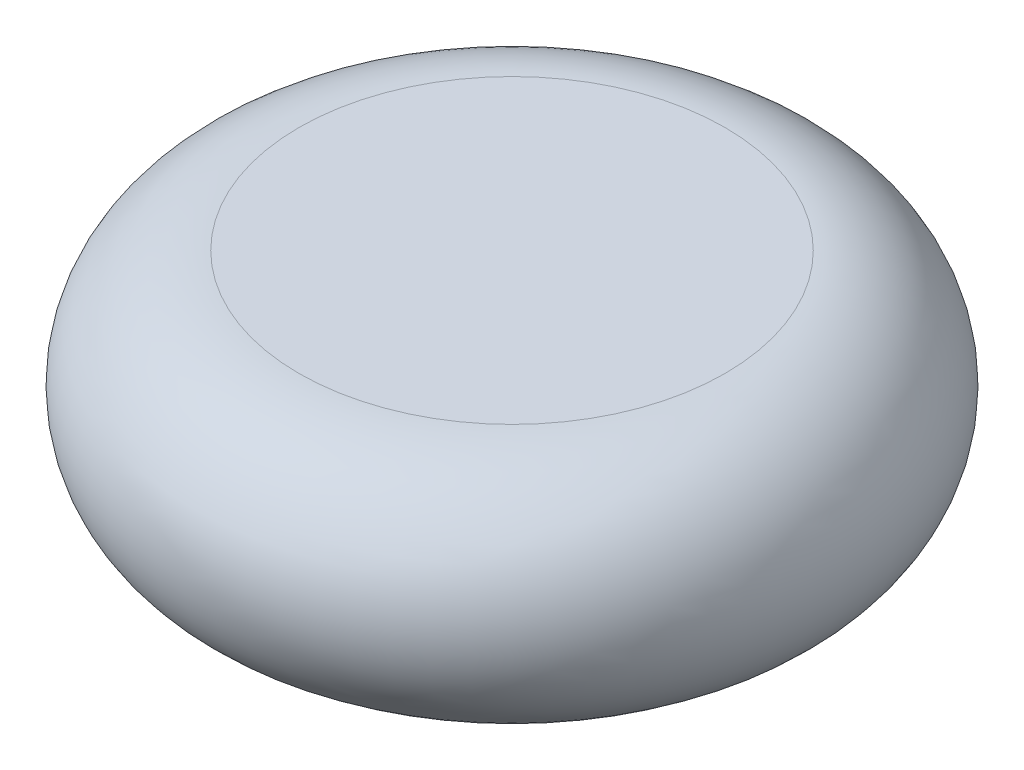
ISO-10303-21;
HEADER;
FILE_DESCRIPTION(('STEP AP214'),'2;1');
FILE_NAME('part.step','',(''),(''),'','','');
FILE_SCHEMA(('AUTOMOTIVE_DESIGN { 1 0 10303 214 1 1 1 1 }'));
ENDSEC;
DATA;
#1=APPLICATION_CONTEXT('core data for automotive mechanical design processes');
#2=APPLICATION_PROTOCOL_DEFINITION('international standard','automotive_design',2000,#1);
#3=PRODUCT_CONTEXT('',#1,'mechanical');
#4=PRODUCT('Part','Part','',(#3));
#5=PRODUCT_RELATED_PRODUCT_CATEGORY('part','',(#4));
#6=PRODUCT_DEFINITION_FORMATION('','',#4);
#7=PRODUCT_DEFINITION_CONTEXT('part definition',#1,'design');
#8=PRODUCT_DEFINITION('design','',#6,#7);
#9=PRODUCT_DEFINITION_SHAPE('','',#8);
#10=(LENGTH_UNIT() NAMED_UNIT(*) SI_UNIT(.MILLI.,.METRE.));
#11=(NAMED_UNIT(*) PLANE_ANGLE_UNIT() SI_UNIT($,.RADIAN.));
#12=(NAMED_UNIT(*) SI_UNIT($,.STERADIAN.) SOLID_ANGLE_UNIT());
#13=UNCERTAINTY_MEASURE_WITH_UNIT(LENGTH_MEASURE(1.E-05),#10,'distance_accuracy_value','');
#14=(GEOMETRIC_REPRESENTATION_CONTEXT(3) GLOBAL_UNCERTAINTY_ASSIGNED_CONTEXT((#13)) GLOBAL_UNIT_ASSIGNED_CONTEXT((#10,
#11,#12)) REPRESENTATION_CONTEXT('',''));
#15=CARTESIAN_POINT('',(0.,0.,0.));
#16=DIRECTION('',(0.,0.,1.));
#17=DIRECTION('',(1.,0.,0.));
#18=AXIS2_PLACEMENT_3D('',#15,#16,#17);
#19=CARTESIAN_POINT('',(0.,250.,0.));
#20=DIRECTION('',(0.,1.,0.));
#21=DIRECTION('',(0.,0.,1.));
#22=AXIS2_PLACEMENT_3D('',#19,#20,#21);
#23=PLANE('',#22);
#24=CARTESIAN_POINT('',(0.,250.,0.));
#25=DIRECTION('',(0.,1.,0.));
#26=DIRECTION('',(0.,0.,1.));
#27=AXIS2_PLACEMENT_3D('',#24,#25,#26);
#28=CIRCLE('',#27,228.6);
#29=CARTESIAN_POINT('',(0.,250.,228.6));
#30=VERTEX_POINT('',#29);
#31=EDGE_CURVE('E38',#30,#30,#28,.T.);
#32=ORIENTED_EDGE('',*,*,#31,.T.);
#33=EDGE_LOOP('',(#32));
#34=FACE_BOUND('',#33,.T.);
#35=ADVANCED_FACE('F31',(#34),#23,.T.);
#36=CARTESIAN_POINT('',(0.,125.,0.));
#37=DIRECTION('',(0.,1.,0.));
#38=DIRECTION('',(0.,0.,1.));
#39=AXIS2_PLACEMENT_3D('',#36,#37,#38);
#40=TOROIDAL_SURFACE('',#39,228.6,125.);
#41=ORIENTED_EDGE('',*,*,#31,.F.);
#42=EDGE_LOOP('',(#41));
#43=FACE_BOUND('',#42,.T.);
#44=CARTESIAN_POINT('',(0.,0.,0.));
#45=DIRECTION('',(0.,1.,0.));
#46=DIRECTION('',(0.,0.,1.));
#47=AXIS2_PLACEMENT_3D('',#44,#45,#46);
#48=CIRCLE('',#47,228.6);
#49=CARTESIAN_POINT('',(0.,0.,228.6));
#50=VERTEX_POINT('',#49);
#51=EDGE_CURVE('E10',#50,#50,#48,.T.);
#52=ORIENTED_EDGE('',*,*,#51,.T.);
#53=EDGE_LOOP('',(#52));
#54=FACE_BOUND('',#53,.T.);
#55=ADVANCED_FACE('F45',(#43,#54),#40,.T.);
#56=CARTESIAN_POINT('',(0.,0.,0.));
#57=DIRECTION('',(0.,1.,0.));
#58=DIRECTION('',(0.,0.,1.));
#59=AXIS2_PLACEMENT_3D('',#56,#57,#58);
#60=PLANE('',#59);
#61=ORIENTED_EDGE('',*,*,#51,.F.);
#62=EDGE_LOOP('',(#61));
#63=FACE_BOUND('',#62,.T.);
#64=ADVANCED_FACE('F33',(#63),#60,.F.);
#65=CLOSED_SHELL('',(#35,#55,#64));
#66=MANIFOLD_SOLID_BREP('B2',#65);
#67=ADVANCED_BREP_SHAPE_REPRESENTATION('',(#18,#66),#14);
#68=SHAPE_DEFINITION_REPRESENTATION(#9,#67);
ENDSEC;
END-ISO-10303-21;
